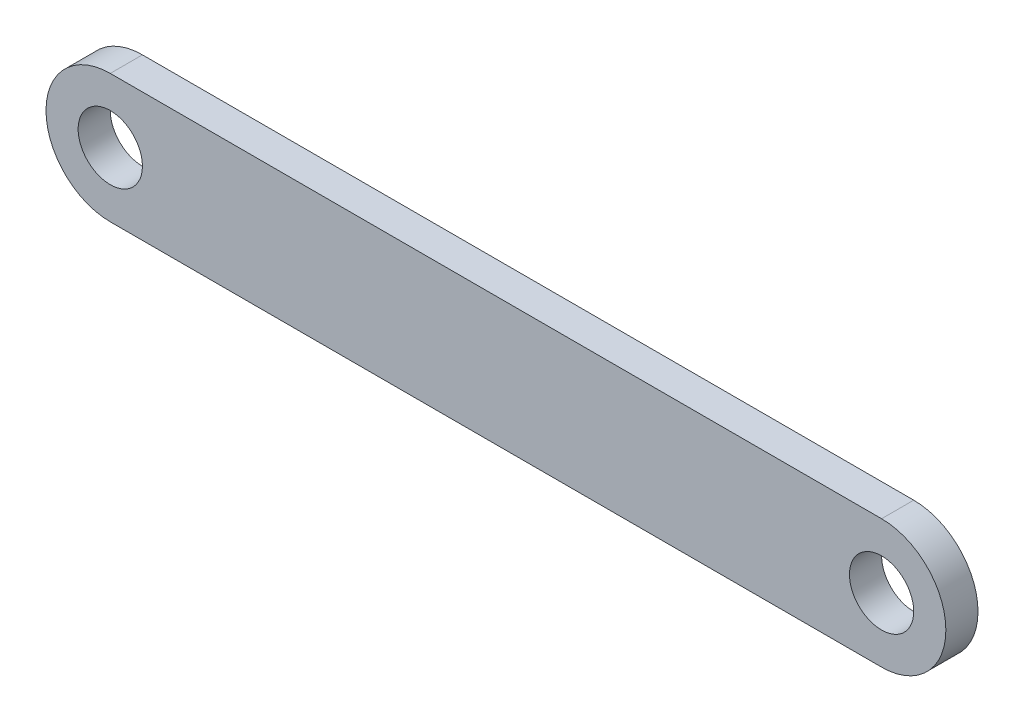
ISO-10303-21;
HEADER;
FILE_DESCRIPTION(('STEP AP214'),'2;1');
FILE_NAME('part.step','',(''),(''),'','','');
FILE_SCHEMA(('AUTOMOTIVE_DESIGN { 1 0 10303 214 1 1 1 1 }'));
ENDSEC;
DATA;
#1=APPLICATION_CONTEXT('core data for automotive mechanical design processes');
#2=APPLICATION_PROTOCOL_DEFINITION('international standard','automotive_design',2000,#1);
#3=PRODUCT_CONTEXT('',#1,'mechanical');
#4=PRODUCT('Part','Part','',(#3));
#5=PRODUCT_RELATED_PRODUCT_CATEGORY('part','',(#4));
#6=PRODUCT_DEFINITION_FORMATION('','',#4);
#7=PRODUCT_DEFINITION_CONTEXT('part definition',#1,'design');
#8=PRODUCT_DEFINITION('design','',#6,#7);
#9=PRODUCT_DEFINITION_SHAPE('','',#8);
#10=(LENGTH_UNIT() NAMED_UNIT(*) SI_UNIT(.MILLI.,.METRE.));
#11=(NAMED_UNIT(*) PLANE_ANGLE_UNIT() SI_UNIT($,.RADIAN.));
#12=(NAMED_UNIT(*) SI_UNIT($,.STERADIAN.) SOLID_ANGLE_UNIT());
#13=UNCERTAINTY_MEASURE_WITH_UNIT(LENGTH_MEASURE(1.E-05),#10,'distance_accuracy_value','');
#14=(GEOMETRIC_REPRESENTATION_CONTEXT(3) GLOBAL_UNCERTAINTY_ASSIGNED_CONTEXT((#13)) GLOBAL_UNIT_ASSIGNED_CONTEXT((#10,
#11,#12)) REPRESENTATION_CONTEXT('',''));
#15=CARTESIAN_POINT('',(0.,0.,0.));
#16=DIRECTION('',(0.,0.,1.));
#17=DIRECTION('',(1.,0.,0.));
#18=AXIS2_PLACEMENT_3D('',#15,#16,#17);
#19=CARTESIAN_POINT('',(-381.,0.,31.75));
#20=DIRECTION('',(0.,0.,-1.));
#21=DIRECTION('',(-1.,0.,0.));
#22=AXIS2_PLACEMENT_3D('',#19,#20,#21);
#23=CYLINDRICAL_SURFACE('',#22,63.5);
#24=CARTESIAN_POINT('',(-381.,0.,0.));
#25=DIRECTION('',(0.,0.,1.));
#26=DIRECTION('',(1.,0.,0.));
#27=AXIS2_PLACEMENT_3D('',#24,#25,#26);
#28=CIRCLE('',#27,63.5);
#29=CARTESIAN_POINT('',(-381.,63.5,0.));
#30=VERTEX_POINT('',#29);
#31=CARTESIAN_POINT('',(-381.,-63.5,0.));
#32=VERTEX_POINT('',#31);
#33=EDGE_CURVE('E98',#30,#32,#28,.T.);
#34=ORIENTED_EDGE('',*,*,#33,.T.);
#35=DIRECTION('',(0.,0.,-1.));
#36=VECTOR('',#35,1.);
#37=CARTESIAN_POINT('',(-381.,-63.5,31.75));
#38=LINE('',#37,#36);
#39=CARTESIAN_POINT('',(-381.,-63.5,31.75));
#40=VERTEX_POINT('',#39);
#41=EDGE_CURVE('E11',#40,#32,#38,.T.);
#42=ORIENTED_EDGE('',*,*,#41,.F.);
#43=CARTESIAN_POINT('',(-381.,0.,31.75));
#44=DIRECTION('',(0.,0.,1.));
#45=DIRECTION('',(1.,0.,0.));
#46=AXIS2_PLACEMENT_3D('',#43,#44,#45);
#47=CIRCLE('',#46,63.5);
#48=CARTESIAN_POINT('',(-381.,63.5,31.75));
#49=VERTEX_POINT('',#48);
#50=EDGE_CURVE('E86',#49,#40,#47,.T.);
#51=ORIENTED_EDGE('',*,*,#50,.F.);
#52=DIRECTION('',(0.,0.,-1.));
#53=VECTOR('',#52,1.);
#54=CARTESIAN_POINT('',(-381.,63.5,31.75));
#55=LINE('',#54,#53);
#56=EDGE_CURVE('E94',#49,#30,#55,.T.);
#57=ORIENTED_EDGE('',*,*,#56,.T.);
#58=EDGE_LOOP('',(#34,#42,#51,#57));
#59=FACE_BOUND('',#58,.T.);
#60=ADVANCED_FACE('F35',(#59),#23,.T.);
#61=CARTESIAN_POINT('',(-381.,-63.5,31.75));
#62=DIRECTION('',(0.,1.,0.));
#63=DIRECTION('',(0.,0.,1.));
#64=AXIS2_PLACEMENT_3D('',#61,#62,#63);
#65=PLANE('',#64);
#66=DIRECTION('',(1.,0.,0.));
#67=VECTOR('',#66,1.);
#68=CARTESIAN_POINT('',(-381.,-63.5,0.));
#69=LINE('',#68,#67);
#70=CARTESIAN_POINT('',(381.,-63.5,0.));
#71=VERTEX_POINT('',#70);
#72=EDGE_CURVE('E90',#32,#71,#69,.T.);
#73=ORIENTED_EDGE('',*,*,#72,.T.);
#74=DIRECTION('',(0.,0.,-1.));
#75=VECTOR('',#74,1.);
#76=CARTESIAN_POINT('',(381.,-63.5,31.75));
#77=LINE('',#76,#75);
#78=CARTESIAN_POINT('',(381.,-63.5,31.75));
#79=VERTEX_POINT('',#78);
#80=EDGE_CURVE('E43',#79,#71,#77,.T.);
#81=ORIENTED_EDGE('',*,*,#80,.F.);
#82=DIRECTION('',(1.,0.,0.));
#83=VECTOR('',#82,1.);
#84=CARTESIAN_POINT('',(-381.,-63.5,31.75));
#85=LINE('',#84,#83);
#86=EDGE_CURVE('E81',#40,#79,#85,.T.);
#87=ORIENTED_EDGE('',*,*,#86,.F.);
#88=ORIENTED_EDGE('',*,*,#41,.T.);
#89=EDGE_LOOP('',(#73,#81,#87,#88));
#90=FACE_BOUND('',#89,.T.);
#91=ADVANCED_FACE('F89',(#90),#65,.F.);
#92=CARTESIAN_POINT('',(381.,0.,31.75));
#93=DIRECTION('',(0.,0.,-1.));
#94=DIRECTION('',(-1.,0.,0.));
#95=AXIS2_PLACEMENT_3D('',#92,#93,#94);
#96=CYLINDRICAL_SURFACE('',#95,63.5);
#97=CARTESIAN_POINT('',(381.,0.,0.));
#98=DIRECTION('',(0.,0.,1.));
#99=DIRECTION('',(1.,0.,0.));
#100=AXIS2_PLACEMENT_3D('',#97,#98,#99);
#101=CIRCLE('',#100,63.5);
#102=CARTESIAN_POINT('',(381.,63.5,0.));
#103=VERTEX_POINT('',#102);
#104=EDGE_CURVE('E68',#71,#103,#101,.T.);
#105=ORIENTED_EDGE('',*,*,#104,.T.);
#106=DIRECTION('',(0.,0.,-1.));
#107=VECTOR('',#106,1.);
#108=CARTESIAN_POINT('',(381.,63.5,31.75));
#109=LINE('',#108,#107);
#110=CARTESIAN_POINT('',(381.,63.5,31.75));
#111=VERTEX_POINT('',#110);
#112=EDGE_CURVE('E91',#111,#103,#109,.T.);
#113=ORIENTED_EDGE('',*,*,#112,.F.);
#114=CARTESIAN_POINT('',(381.,0.,31.75));
#115=DIRECTION('',(0.,0.,1.));
#116=DIRECTION('',(1.,0.,0.));
#117=AXIS2_PLACEMENT_3D('',#114,#115,#116);
#118=CIRCLE('',#117,63.5);
#119=EDGE_CURVE('E84',#79,#111,#118,.T.);
#120=ORIENTED_EDGE('',*,*,#119,.F.);
#121=ORIENTED_EDGE('',*,*,#80,.T.);
#122=EDGE_LOOP('',(#105,#113,#120,#121));
#123=FACE_BOUND('',#122,.T.);
#124=ADVANCED_FACE('F92',(#123),#96,.T.);
#125=CARTESIAN_POINT('',(-381.,63.5,31.75));
#126=DIRECTION('',(0.,-1.,0.));
#127=DIRECTION('',(0.,0.,-1.));
#128=AXIS2_PLACEMENT_3D('',#125,#126,#127);
#129=PLANE('',#128);
#130=DIRECTION('',(-1.,0.,0.));
#131=VECTOR('',#130,1.);
#132=CARTESIAN_POINT('',(-381.,63.5,0.));
#133=LINE('',#132,#131);
#134=EDGE_CURVE('E74',#103,#30,#133,.T.);
#135=ORIENTED_EDGE('',*,*,#134,.T.);
#136=ORIENTED_EDGE('',*,*,#56,.F.);
#137=DIRECTION('',(-1.,0.,0.));
#138=VECTOR('',#137,1.);
#139=CARTESIAN_POINT('',(-381.,63.5,31.75));
#140=LINE('',#139,#138);
#141=EDGE_CURVE('E51',#111,#49,#140,.T.);
#142=ORIENTED_EDGE('',*,*,#141,.F.);
#143=ORIENTED_EDGE('',*,*,#112,.T.);
#144=EDGE_LOOP('',(#135,#136,#142,#143));
#145=FACE_BOUND('',#144,.T.);
#146=ADVANCED_FACE('F106',(#145),#129,.F.);
#147=CARTESIAN_POINT('',(-381.,0.,31.75));
#148=DIRECTION('',(0.,0.,1.));
#149=DIRECTION('',(1.,0.,0.));
#150=AXIS2_PLACEMENT_3D('',#147,#148,#149);
#151=PLANE('',#150);
#152=CARTESIAN_POINT('',(-381.,0.,31.75));
#153=DIRECTION('',(0.,0.,1.));
#154=DIRECTION('',(1.,0.,0.));
#155=AXIS2_PLACEMENT_3D('',#152,#153,#154);
#156=CIRCLE('',#155,31.75);
#157=CARTESIAN_POINT('',(-349.25,0.,31.75));
#158=VERTEX_POINT('',#157);
#159=EDGE_CURVE('E118',#158,#158,#156,.T.);
#160=ORIENTED_EDGE('',*,*,#159,.F.);
#161=EDGE_LOOP('',(#160));
#162=FACE_BOUND('',#161,.T.);
#163=CARTESIAN_POINT('',(381.,0.,31.75));
#164=DIRECTION('',(0.,0.,1.));
#165=DIRECTION('',(1.,0.,0.));
#166=AXIS2_PLACEMENT_3D('',#163,#164,#165);
#167=CIRCLE('',#166,31.75);
#168=CARTESIAN_POINT('',(412.75,0.,31.75));
#169=VERTEX_POINT('',#168);
#170=EDGE_CURVE('E112',#169,#169,#167,.T.);
#171=ORIENTED_EDGE('',*,*,#170,.F.);
#172=EDGE_LOOP('',(#171));
#173=FACE_BOUND('',#172,.T.);
#174=ORIENTED_EDGE('',*,*,#50,.T.);
#175=ORIENTED_EDGE('',*,*,#86,.T.);
#176=ORIENTED_EDGE('',*,*,#119,.T.);
#177=ORIENTED_EDGE('',*,*,#141,.T.);
#178=EDGE_LOOP('',(#174,#175,#176,#177));
#179=FACE_BOUND('',#178,.T.);
#180=ADVANCED_FACE('F82',(#162,#173,#179),#151,.T.);
#181=CARTESIAN_POINT('',(-381.,0.,0.));
#182=DIRECTION('',(0.,0.,1.));
#183=DIRECTION('',(1.,0.,0.));
#184=AXIS2_PLACEMENT_3D('',#181,#182,#183);
#185=PLANE('',#184);
#186=CARTESIAN_POINT('',(-381.,0.,0.));
#187=DIRECTION('',(0.,0.,1.));
#188=DIRECTION('',(1.,0.,0.));
#189=AXIS2_PLACEMENT_3D('',#186,#187,#188);
#190=CIRCLE('',#189,31.75);
#191=CARTESIAN_POINT('',(-349.25,0.,0.));
#192=VERTEX_POINT('',#191);
#193=EDGE_CURVE('E101',#192,#192,#190,.T.);
#194=ORIENTED_EDGE('',*,*,#193,.T.);
#195=EDGE_LOOP('',(#194));
#196=FACE_BOUND('',#195,.T.);
#197=CARTESIAN_POINT('',(381.,0.,0.));
#198=DIRECTION('',(0.,0.,1.));
#199=DIRECTION('',(1.,0.,0.));
#200=AXIS2_PLACEMENT_3D('',#197,#198,#199);
#201=CIRCLE('',#200,31.75);
#202=CARTESIAN_POINT('',(412.75,0.,0.));
#203=VERTEX_POINT('',#202);
#204=EDGE_CURVE('E115',#203,#203,#201,.T.);
#205=ORIENTED_EDGE('',*,*,#204,.T.);
#206=EDGE_LOOP('',(#205));
#207=FACE_BOUND('',#206,.T.);
#208=ORIENTED_EDGE('',*,*,#33,.F.);
#209=ORIENTED_EDGE('',*,*,#134,.F.);
#210=ORIENTED_EDGE('',*,*,#104,.F.);
#211=ORIENTED_EDGE('',*,*,#72,.F.);
#212=EDGE_LOOP('',(#208,#209,#210,#211));
#213=FACE_BOUND('',#212,.T.);
#214=ADVANCED_FACE('F109',(#196,#207,#213),#185,.F.);
#215=CARTESIAN_POINT('',(381.,0.,0.));
#216=DIRECTION('',(0.,0.,1.));
#217=DIRECTION('',(1.,0.,0.));
#218=AXIS2_PLACEMENT_3D('',#215,#216,#217);
#219=CYLINDRICAL_SURFACE('',#218,31.75);
#220=ORIENTED_EDGE('',*,*,#204,.F.);
#221=EDGE_LOOP('',(#220));
#222=FACE_BOUND('',#221,.T.);
#223=ORIENTED_EDGE('',*,*,#170,.T.);
#224=EDGE_LOOP('',(#223));
#225=FACE_BOUND('',#224,.T.);
#226=ADVANCED_FACE('F129',(#222,#225),#219,.F.);
#227=CARTESIAN_POINT('',(-381.,0.,0.));
#228=DIRECTION('',(0.,0.,1.));
#229=DIRECTION('',(1.,0.,0.));
#230=AXIS2_PLACEMENT_3D('',#227,#228,#229);
#231=CYLINDRICAL_SURFACE('',#230,31.75);
#232=ORIENTED_EDGE('',*,*,#193,.F.);
#233=EDGE_LOOP('',(#232));
#234=FACE_BOUND('',#233,.T.);
#235=ORIENTED_EDGE('',*,*,#159,.T.);
#236=EDGE_LOOP('',(#235));
#237=FACE_BOUND('',#236,.T.);
#238=ADVANCED_FACE('F126',(#234,#237),#231,.F.);
#239=CLOSED_SHELL('',(#60,#91,#124,#146,#180,#214,#226,#238));
#240=MANIFOLD_SOLID_BREP('B2',#239);
#241=ADVANCED_BREP_SHAPE_REPRESENTATION('',(#18,#240),#14);
#242=SHAPE_DEFINITION_REPRESENTATION(#9,#241);
ENDSEC;
END-ISO-10303-21;
